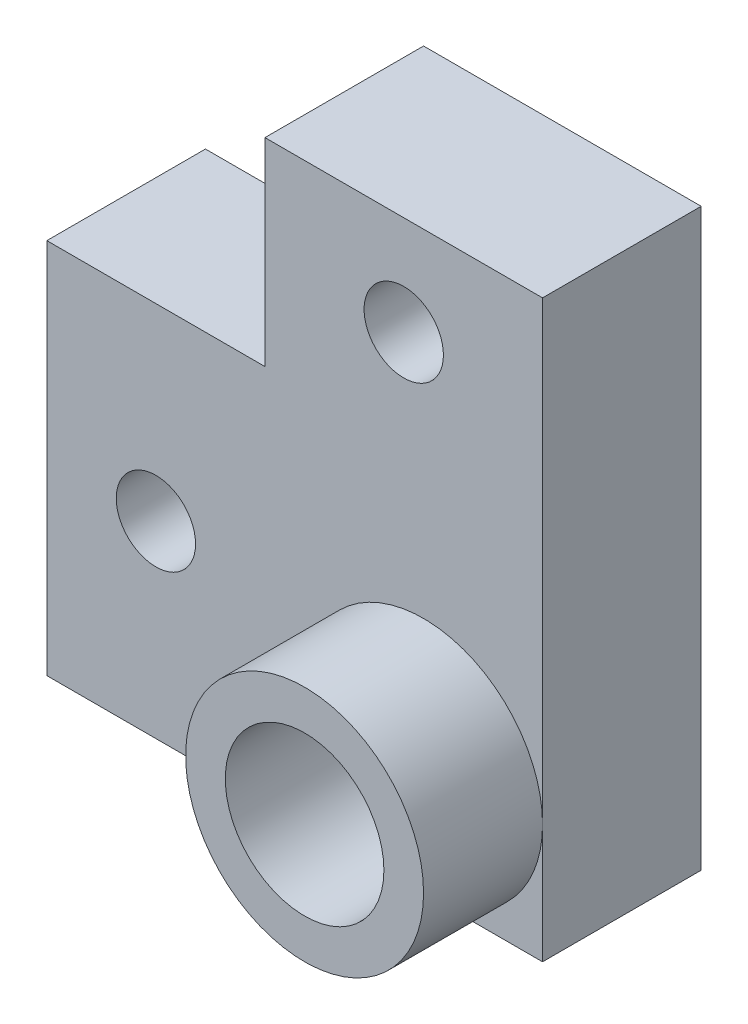
ISO-10303-21;
HEADER;
FILE_DESCRIPTION(('STEP AP214'),'2;1');
FILE_NAME('part.step','',(''),(''),'','','');
FILE_SCHEMA(('AUTOMOTIVE_DESIGN { 1 0 10303 214 1 1 1 1 }'));
ENDSEC;
DATA;
#1=APPLICATION_CONTEXT('core data for automotive mechanical design processes');
#2=APPLICATION_PROTOCOL_DEFINITION('international standard','automotive_design',2000,#1);
#3=PRODUCT_CONTEXT('',#1,'mechanical');
#4=PRODUCT('Part','Part','',(#3));
#5=PRODUCT_RELATED_PRODUCT_CATEGORY('part','',(#4));
#6=PRODUCT_DEFINITION_FORMATION('','',#4);
#7=PRODUCT_DEFINITION_CONTEXT('part definition',#1,'design');
#8=PRODUCT_DEFINITION('design','',#6,#7);
#9=PRODUCT_DEFINITION_SHAPE('','',#8);
#10=(LENGTH_UNIT() NAMED_UNIT(*) SI_UNIT(.MILLI.,.METRE.));
#11=(NAMED_UNIT(*) PLANE_ANGLE_UNIT() SI_UNIT($,.RADIAN.));
#12=(NAMED_UNIT(*) SI_UNIT($,.STERADIAN.) SOLID_ANGLE_UNIT());
#13=UNCERTAINTY_MEASURE_WITH_UNIT(LENGTH_MEASURE(1.E-05),#10,'distance_accuracy_value','');
#14=(GEOMETRIC_REPRESENTATION_CONTEXT(3) GLOBAL_UNCERTAINTY_ASSIGNED_CONTEXT((#13)) GLOBAL_UNIT_ASSIGNED_CONTEXT((#10,
#11,#12)) REPRESENTATION_CONTEXT('',''));
#15=CARTESIAN_POINT('',(0.,0.,0.));
#16=DIRECTION('',(0.,0.,1.));
#17=DIRECTION('',(1.,0.,0.));
#18=AXIS2_PLACEMENT_3D('',#15,#16,#17);
#19=CARTESIAN_POINT('',(0.,0.,8.));
#20=DIRECTION('',(0.,0.,1.));
#21=DIRECTION('',(1.,0.,0.));
#22=AXIS2_PLACEMENT_3D('',#19,#20,#21);
#23=PLANE('',#22);
#24=CARTESIAN_POINT('',(6.20529801324503,-1.08609271523178,8.));
#25=DIRECTION('',(0.,0.,1.));
#26=DIRECTION('',(1.,0.,0.));
#27=AXIS2_PLACEMENT_3D('',#24,#25,#26);
#28=CIRCLE('',#27,6.);
#29=CARTESIAN_POINT('',(12.205298013245,-1.08609271523178,8.));
#30=VERTEX_POINT('',#29);
#31=CARTESIAN_POINT('',(6.20529801324503,-7.08609271523178,8.));
#32=VERTEX_POINT('',#31);
#33=EDGE_CURVE('E43',#30,#32,#28,.T.);
#34=ORIENTED_EDGE('',*,*,#33,.F.);
#35=DIRECTION('',(0.,1.,0.));
#36=VECTOR('',#35,1.);
#37=CARTESIAN_POINT('',(12.205298013245,11.9139072847682,8.));
#38=LINE('',#37,#36);
#39=CARTESIAN_POINT('',(12.205298013245,21.9139072847682,8.));
#40=VERTEX_POINT('',#39);
#41=EDGE_CURVE('E98',#30,#40,#38,.T.);
#42=ORIENTED_EDGE('',*,*,#41,.T.);
#43=DIRECTION('',(1.,0.,0.));
#44=VECTOR('',#43,1.);
#45=CARTESIAN_POINT('',(12.205298013245,21.9139072847682,8.));
#46=LINE('',#45,#44);
#47=CARTESIAN_POINT('',(-1.79470198675497,21.9139072847682,8.));
#48=VERTEX_POINT('',#47);
#49=EDGE_CURVE('E196',#48,#40,#46,.T.);
#50=ORIENTED_EDGE('',*,*,#49,.F.);
#51=DIRECTION('',(0.,-1.,0.));
#52=VECTOR('',#51,1.);
#53=CARTESIAN_POINT('',(-1.79470198675497,21.9139072847682,8.));
#54=LINE('',#53,#52);
#55=CARTESIAN_POINT('',(-1.79470198675497,11.9139072847682,8.));
#56=VERTEX_POINT('',#55);
#57=EDGE_CURVE('E198',#48,#56,#54,.T.);
#58=ORIENTED_EDGE('',*,*,#57,.T.);
#59=DIRECTION('',(-1.,0.,0.));
#60=VECTOR('',#59,1.);
#61=CARTESIAN_POINT('',(-12.794701986755,11.9139072847682,8.));
#62=LINE('',#61,#60);
#63=CARTESIAN_POINT('',(-12.794701986755,11.9139072847682,8.));
#64=VERTEX_POINT('',#63);
#65=EDGE_CURVE('E97',#56,#64,#62,.T.);
#66=ORIENTED_EDGE('',*,*,#65,.T.);
#67=DIRECTION('',(0.,-1.,0.));
#68=VECTOR('',#67,1.);
#69=CARTESIAN_POINT('',(-12.794701986755,11.9139072847682,8.));
#70=LINE('',#69,#68);
#71=CARTESIAN_POINT('',(-12.794701986755,-7.08609271523178,8.));
#72=VERTEX_POINT('',#71);
#73=EDGE_CURVE('E174',#64,#72,#70,.T.);
#74=ORIENTED_EDGE('',*,*,#73,.T.);
#75=DIRECTION('',(1.,0.,0.));
#76=VECTOR('',#75,1.);
#77=CARTESIAN_POINT('',(-12.794701986755,-7.08609271523178,8.));
#78=LINE('',#77,#76);
#79=EDGE_CURVE('E108',#72,#32,#78,.T.);
#80=ORIENTED_EDGE('',*,*,#79,.T.);
#81=EDGE_LOOP('',(#34,#42,#50,#58,#66,#74,#80));
#82=FACE_BOUND('',#81,.T.);
#83=CARTESIAN_POINT('',(-7.29470198675498,2.41390728476822,8.));
#84=DIRECTION('',(0.,0.,1.));
#85=DIRECTION('',(1.,0.,0.));
#86=AXIS2_PLACEMENT_3D('',#83,#84,#85);
#87=CIRCLE('',#86,2.);
#88=CARTESIAN_POINT('',(-5.29470198675498,2.41390728476822,8.));
#89=VERTEX_POINT('',#88);
#90=EDGE_CURVE('E184',#89,#89,#87,.T.);
#91=ORIENTED_EDGE('',*,*,#90,.F.);
#92=EDGE_LOOP('',(#91));
#93=FACE_BOUND('',#92,.T.);
#94=CARTESIAN_POINT('',(5.20529801324503,16.9139072847682,8.));
#95=DIRECTION('',(0.,0.,1.));
#96=DIRECTION('',(1.,0.,0.));
#97=AXIS2_PLACEMENT_3D('',#94,#95,#96);
#98=CIRCLE('',#97,2.);
#99=CARTESIAN_POINT('',(7.20529801324503,16.9139072847682,8.));
#100=VERTEX_POINT('',#99);
#101=EDGE_CURVE('E211',#100,#100,#98,.T.);
#102=ORIENTED_EDGE('',*,*,#101,.F.);
#103=EDGE_LOOP('',(#102));
#104=FACE_BOUND('',#103,.T.);
#105=ADVANCED_FACE('F32',(#82,#93,#104),#23,.T.);
#106=CARTESIAN_POINT('',(-12.794701986755,11.9139072847682,8.));
#107=DIRECTION('',(0.,-1.,0.));
#108=DIRECTION('',(0.,0.,-1.));
#109=AXIS2_PLACEMENT_3D('',#106,#107,#108);
#110=PLANE('',#109);
#111=DIRECTION('',(0.,0.,1.));
#112=VECTOR('',#111,1.);
#113=CARTESIAN_POINT('',(-1.79470198675497,11.9139072847682,8.));
#114=LINE('',#113,#112);
#115=CARTESIAN_POINT('',(-1.79470198675497,11.9139072847682,0.));
#116=VERTEX_POINT('',#115);
#117=EDGE_CURVE('E56',#116,#56,#114,.T.);
#118=ORIENTED_EDGE('',*,*,#117,.F.);
#119=DIRECTION('',(-1.,0.,0.));
#120=VECTOR('',#119,1.);
#121=CARTESIAN_POINT('',(-12.794701986755,11.9139072847682,0.));
#122=LINE('',#121,#120);
#123=CARTESIAN_POINT('',(-12.794701986755,11.9139072847682,0.));
#124=VERTEX_POINT('',#123);
#125=EDGE_CURVE('E172',#116,#124,#122,.T.);
#126=ORIENTED_EDGE('',*,*,#125,.T.);
#127=DIRECTION('',(0.,0.,-1.));
#128=VECTOR('',#127,1.);
#129=CARTESIAN_POINT('',(-12.794701986755,11.9139072847682,8.));
#130=LINE('',#129,#128);
#131=EDGE_CURVE('E168',#64,#124,#130,.T.);
#132=ORIENTED_EDGE('',*,*,#131,.F.);
#133=ORIENTED_EDGE('',*,*,#65,.F.);
#134=EDGE_LOOP('',(#118,#126,#132,#133));
#135=FACE_BOUND('',#134,.T.);
#136=ADVANCED_FACE('F130',(#135),#110,.F.);
#137=CARTESIAN_POINT('',(-12.794701986755,11.9139072847682,8.));
#138=DIRECTION('',(1.,0.,0.));
#139=DIRECTION('',(0.,1.,0.));
#140=AXIS2_PLACEMENT_3D('',#137,#138,#139);
#141=PLANE('',#140);
#142=DIRECTION('',(0.,-1.,0.));
#143=VECTOR('',#142,1.);
#144=CARTESIAN_POINT('',(-12.794701986755,11.9139072847682,0.));
#145=LINE('',#144,#143);
#146=CARTESIAN_POINT('',(-12.794701986755,-7.08609271523178,0.));
#147=VERTEX_POINT('',#146);
#148=EDGE_CURVE('E165',#124,#147,#145,.T.);
#149=ORIENTED_EDGE('',*,*,#148,.T.);
#150=DIRECTION('',(0.,0.,-1.));
#151=VECTOR('',#150,1.);
#152=CARTESIAN_POINT('',(-12.794701986755,-7.08609271523178,8.));
#153=LINE('',#152,#151);
#154=EDGE_CURVE('E41',#72,#147,#153,.T.);
#155=ORIENTED_EDGE('',*,*,#154,.F.);
#156=ORIENTED_EDGE('',*,*,#73,.F.);
#157=ORIENTED_EDGE('',*,*,#131,.T.);
#158=EDGE_LOOP('',(#149,#155,#156,#157));
#159=FACE_BOUND('',#158,.T.);
#160=ADVANCED_FACE('F34',(#159),#141,.F.);
#161=CARTESIAN_POINT('',(-12.794701986755,-7.08609271523178,8.));
#162=DIRECTION('',(0.,1.,0.));
#163=DIRECTION('',(0.,0.,1.));
#164=AXIS2_PLACEMENT_3D('',#161,#162,#163);
#165=PLANE('',#164);
#166=DIRECTION('',(1.,0.,0.));
#167=VECTOR('',#166,1.);
#168=CARTESIAN_POINT('',(-12.794701986755,-7.08609271523178,0.));
#169=LINE('',#168,#167);
#170=CARTESIAN_POINT('',(12.205298013245,-7.08609271523178,0.));
#171=VERTEX_POINT('',#170);
#172=EDGE_CURVE('E157',#147,#171,#169,.T.);
#173=ORIENTED_EDGE('',*,*,#172,.T.);
#174=DIRECTION('',(0.,0.,-1.));
#175=VECTOR('',#174,1.);
#176=CARTESIAN_POINT('',(12.205298013245,-7.08609271523178,8.));
#177=LINE('',#176,#175);
#178=CARTESIAN_POINT('',(12.205298013245,-7.08609271523178,8.));
#179=VERTEX_POINT('',#178);
#180=EDGE_CURVE('E158',#179,#171,#177,.T.);
#181=ORIENTED_EDGE('',*,*,#180,.F.);
#182=EDGE_CURVE('E93',#32,#179,#78,.T.);
#183=ORIENTED_EDGE('',*,*,#182,.F.);
#184=ORIENTED_EDGE('',*,*,#79,.F.);
#185=ORIENTED_EDGE('',*,*,#154,.T.);
#186=EDGE_LOOP('',(#173,#181,#183,#184,#185));
#187=FACE_BOUND('',#186,.T.);
#188=ADVANCED_FACE('F146',(#187),#165,.F.);
#189=CARTESIAN_POINT('',(12.205298013245,11.9139072847682,8.));
#190=DIRECTION('',(-1.,0.,0.));
#191=DIRECTION('',(0.,-1.,0.));
#192=AXIS2_PLACEMENT_3D('',#189,#190,#191);
#193=PLANE('',#192);
#194=DIRECTION('',(0.,1.,0.));
#195=VECTOR('',#194,1.);
#196=CARTESIAN_POINT('',(12.205298013245,11.9139072847682,0.));
#197=LINE('',#196,#195);
#198=CARTESIAN_POINT('',(12.205298013245,21.9139072847682,0.));
#199=VERTEX_POINT('',#198);
#200=EDGE_CURVE('E164',#171,#199,#197,.T.);
#201=ORIENTED_EDGE('',*,*,#200,.T.);
#202=DIRECTION('',(0.,0.,-1.));
#203=VECTOR('',#202,1.);
#204=CARTESIAN_POINT('',(12.205298013245,21.9139072847682,8.));
#205=LINE('',#204,#203);
#206=EDGE_CURVE('E104',#40,#199,#205,.T.);
#207=ORIENTED_EDGE('',*,*,#206,.F.);
#208=ORIENTED_EDGE('',*,*,#41,.F.);
#209=EDGE_CURVE('E90',#179,#30,#38,.T.);
#210=ORIENTED_EDGE('',*,*,#209,.F.);
#211=ORIENTED_EDGE('',*,*,#180,.T.);
#212=EDGE_LOOP('',(#201,#207,#208,#210,#211));
#213=FACE_BOUND('',#212,.T.);
#214=ADVANCED_FACE('F102',(#213),#193,.F.);
#215=EDGE_CURVE('E11',#32,#30,#28,.T.);
#216=ORIENTED_EDGE('',*,*,#215,.F.);
#217=ORIENTED_EDGE('',*,*,#182,.T.);
#218=ORIENTED_EDGE('',*,*,#209,.T.);
#219=EDGE_LOOP('',(#216,#217,#218));
#220=FACE_BOUND('',#219,.T.);
#221=ADVANCED_FACE('F92',(#220),#23,.T.);
#222=CARTESIAN_POINT('',(0.,0.,0.));
#223=DIRECTION('',(0.,0.,1.));
#224=DIRECTION('',(1.,0.,0.));
#225=AXIS2_PLACEMENT_3D('',#222,#223,#224);
#226=PLANE('',#225);
#227=CARTESIAN_POINT('',(6.20529801324503,-1.08609271523178,0.));
#228=DIRECTION('',(0.,0.,1.));
#229=DIRECTION('',(1.,0.,0.));
#230=AXIS2_PLACEMENT_3D('',#227,#228,#229);
#231=CIRCLE('',#230,4.);
#232=CARTESIAN_POINT('',(10.205298013245,-1.08609271523178,0.));
#233=VERTEX_POINT('',#232);
#234=EDGE_CURVE('E36',#233,#233,#231,.T.);
#235=ORIENTED_EDGE('',*,*,#234,.T.);
#236=EDGE_LOOP('',(#235));
#237=FACE_BOUND('',#236,.T.);
#238=CARTESIAN_POINT('',(-7.29470198675498,2.41390728476822,0.));
#239=DIRECTION('',(0.,0.,1.));
#240=DIRECTION('',(1.,0.,0.));
#241=AXIS2_PLACEMENT_3D('',#238,#239,#240);
#242=CIRCLE('',#241,2.);
#243=CARTESIAN_POINT('',(-5.29470198675498,2.41390728476822,0.));
#244=VERTEX_POINT('',#243);
#245=EDGE_CURVE('E183',#244,#244,#242,.T.);
#246=ORIENTED_EDGE('',*,*,#245,.T.);
#247=EDGE_LOOP('',(#246));
#248=FACE_BOUND('',#247,.T.);
#249=CARTESIAN_POINT('',(5.20529801324503,16.9139072847682,0.));
#250=DIRECTION('',(0.,0.,1.));
#251=DIRECTION('',(1.,0.,0.));
#252=AXIS2_PLACEMENT_3D('',#249,#250,#251);
#253=CIRCLE('',#252,2.);
#254=CARTESIAN_POINT('',(7.20529801324503,16.9139072847682,0.));
#255=VERTEX_POINT('',#254);
#256=EDGE_CURVE('E181',#255,#255,#253,.T.);
#257=ORIENTED_EDGE('',*,*,#256,.T.);
#258=EDGE_LOOP('',(#257));
#259=FACE_BOUND('',#258,.T.);
#260=ORIENTED_EDGE('',*,*,#148,.F.);
#261=ORIENTED_EDGE('',*,*,#125,.F.);
#262=DIRECTION('',(0.,-1.,0.));
#263=VECTOR('',#262,1.);
#264=CARTESIAN_POINT('',(-1.79470198675497,21.9139072847682,0.));
#265=LINE('',#264,#263);
#266=CARTESIAN_POINT('',(-1.79470198675497,21.9139072847682,0.));
#267=VERTEX_POINT('',#266);
#268=EDGE_CURVE('E200',#267,#116,#265,.T.);
#269=ORIENTED_EDGE('',*,*,#268,.F.);
#270=DIRECTION('',(-1.,0.,0.));
#271=VECTOR('',#270,1.);
#272=CARTESIAN_POINT('',(12.205298013245,21.9139072847682,0.));
#273=LINE('',#272,#271);
#274=EDGE_CURVE('E171',#199,#267,#273,.T.);
#275=ORIENTED_EDGE('',*,*,#274,.F.);
#276=ORIENTED_EDGE('',*,*,#200,.F.);
#277=ORIENTED_EDGE('',*,*,#172,.F.);
#278=EDGE_LOOP('',(#260,#261,#269,#275,#276,#277));
#279=FACE_BOUND('',#278,.T.);
#280=ADVANCED_FACE('F139',(#237,#248,#259,#279),#226,.F.);
#281=CARTESIAN_POINT('',(-1.79470198675497,21.9139072847682,8.));
#282=DIRECTION('',(1.,0.,0.));
#283=DIRECTION('',(0.,0.,-1.));
#284=AXIS2_PLACEMENT_3D('',#281,#282,#283);
#285=PLANE('',#284);
#286=ORIENTED_EDGE('',*,*,#117,.T.);
#287=ORIENTED_EDGE('',*,*,#57,.F.);
#288=DIRECTION('',(0.,0.,1.));
#289=VECTOR('',#288,1.);
#290=CARTESIAN_POINT('',(-1.79470198675497,21.9139072847682,8.));
#291=LINE('',#290,#289);
#292=EDGE_CURVE('E207',#267,#48,#291,.T.);
#293=ORIENTED_EDGE('',*,*,#292,.F.);
#294=ORIENTED_EDGE('',*,*,#268,.T.);
#295=EDGE_LOOP('',(#286,#287,#293,#294));
#296=FACE_BOUND('',#295,.T.);
#297=ADVANCED_FACE('F144',(#296),#285,.F.);
#298=CARTESIAN_POINT('',(0.,21.9139072847682,0.));
#299=DIRECTION('',(0.,1.,0.));
#300=DIRECTION('',(0.,0.,1.));
#301=AXIS2_PLACEMENT_3D('',#298,#299,#300);
#302=PLANE('',#301);
#303=ORIENTED_EDGE('',*,*,#206,.T.);
#304=ORIENTED_EDGE('',*,*,#274,.T.);
#305=ORIENTED_EDGE('',*,*,#292,.T.);
#306=ORIENTED_EDGE('',*,*,#49,.T.);
#307=EDGE_LOOP('',(#303,#304,#305,#306));
#308=FACE_BOUND('',#307,.T.);
#309=ADVANCED_FACE('F235',(#308),#302,.T.);
#310=CARTESIAN_POINT('',(5.20529801324503,16.9139072847682,-12.));
#311=DIRECTION('',(0.,0.,1.));
#312=DIRECTION('',(1.,0.,0.));
#313=AXIS2_PLACEMENT_3D('',#310,#311,#312);
#314=CYLINDRICAL_SURFACE('',#313,2.);
#315=ORIENTED_EDGE('',*,*,#101,.T.);
#316=EDGE_LOOP('',(#315));
#317=FACE_BOUND('',#316,.T.);
#318=ORIENTED_EDGE('',*,*,#256,.F.);
#319=EDGE_LOOP('',(#318));
#320=FACE_BOUND('',#319,.T.);
#321=ADVANCED_FACE('F228',(#317,#320),#314,.F.);
#322=CARTESIAN_POINT('',(-7.29470198675498,2.41390728476822,-12.));
#323=DIRECTION('',(0.,0.,1.));
#324=DIRECTION('',(1.,0.,0.));
#325=AXIS2_PLACEMENT_3D('',#322,#323,#324);
#326=CYLINDRICAL_SURFACE('',#325,2.);
#327=ORIENTED_EDGE('',*,*,#90,.T.);
#328=EDGE_LOOP('',(#327));
#329=FACE_BOUND('',#328,.T.);
#330=ORIENTED_EDGE('',*,*,#245,.F.);
#331=EDGE_LOOP('',(#330));
#332=FACE_BOUND('',#331,.T.);
#333=ADVANCED_FACE('F223',(#329,#332),#326,.F.);
#334=CARTESIAN_POINT('',(6.20529801324503,-1.08609271523178,-12.));
#335=DIRECTION('',(0.,0.,1.));
#336=DIRECTION('',(1.,0.,0.));
#337=AXIS2_PLACEMENT_3D('',#334,#335,#336);
#338=CYLINDRICAL_SURFACE('',#337,4.);
#339=ORIENTED_EDGE('',*,*,#234,.F.);
#340=EDGE_LOOP('',(#339));
#341=FACE_BOUND('',#340,.T.);
#342=CARTESIAN_POINT('',(6.20529801324503,-1.08609271523178,14.));
#343=DIRECTION('',(0.,0.,1.));
#344=DIRECTION('',(1.,0.,0.));
#345=AXIS2_PLACEMENT_3D('',#342,#343,#344);
#346=CIRCLE('',#345,4.);
#347=CARTESIAN_POINT('',(10.205298013245,-1.08609271523178,14.));
#348=VERTEX_POINT('',#347);
#349=EDGE_CURVE('E115',#348,#348,#346,.T.);
#350=ORIENTED_EDGE('',*,*,#349,.T.);
#351=EDGE_LOOP('',(#350));
#352=FACE_BOUND('',#351,.T.);
#353=ADVANCED_FACE('F124',(#341,#352),#338,.F.);
#354=CARTESIAN_POINT('',(6.20529801324503,-1.08609271523178,14.));
#355=DIRECTION('',(0.,0.,1.));
#356=DIRECTION('',(1.,0.,0.));
#357=AXIS2_PLACEMENT_3D('',#354,#355,#356);
#358=PLANE('',#357);
#359=CARTESIAN_POINT('',(6.20529801324503,-1.08609271523178,14.));
#360=DIRECTION('',(0.,0.,1.));
#361=DIRECTION('',(1.,0.,0.));
#362=AXIS2_PLACEMENT_3D('',#359,#360,#361);
#363=CIRCLE('',#362,6.);
#364=CARTESIAN_POINT('',(12.205298013245,-1.08609271523178,14.));
#365=VERTEX_POINT('',#364);
#366=EDGE_CURVE('E114',#365,#365,#363,.T.);
#367=ORIENTED_EDGE('',*,*,#366,.T.);
#368=EDGE_LOOP('',(#367));
#369=FACE_BOUND('',#368,.T.);
#370=ORIENTED_EDGE('',*,*,#349,.F.);
#371=EDGE_LOOP('',(#370));
#372=FACE_BOUND('',#371,.T.);
#373=ADVANCED_FACE('F118',(#369,#372),#358,.T.);
#374=CARTESIAN_POINT('',(6.20529801324503,-1.08609271523178,14.));
#375=DIRECTION('',(0.,0.,-1.));
#376=DIRECTION('',(-1.,0.,0.));
#377=AXIS2_PLACEMENT_3D('',#374,#375,#376);
#378=CYLINDRICAL_SURFACE('',#377,6.);
#379=ORIENTED_EDGE('',*,*,#366,.F.);
#380=EDGE_LOOP('',(#379));
#381=FACE_BOUND('',#380,.T.);
#382=ORIENTED_EDGE('',*,*,#33,.T.);
#383=ORIENTED_EDGE('',*,*,#215,.T.);
#384=EDGE_LOOP('',(#382,#383));
#385=FACE_BOUND('',#384,.T.);
#386=ADVANCED_FACE('F116',(#381,#385),#378,.T.);
#387=CLOSED_SHELL('',(#105,#136,#160,#188,#214,#221,#280,#297,#309,#321,#333,#353,#373,#386));
#388=MANIFOLD_SOLID_BREP('B2',#387);
#389=ADVANCED_BREP_SHAPE_REPRESENTATION('',(#18,#388),#14);
#390=SHAPE_DEFINITION_REPRESENTATION(#9,#389);
ENDSEC;
END-ISO-10303-21;
